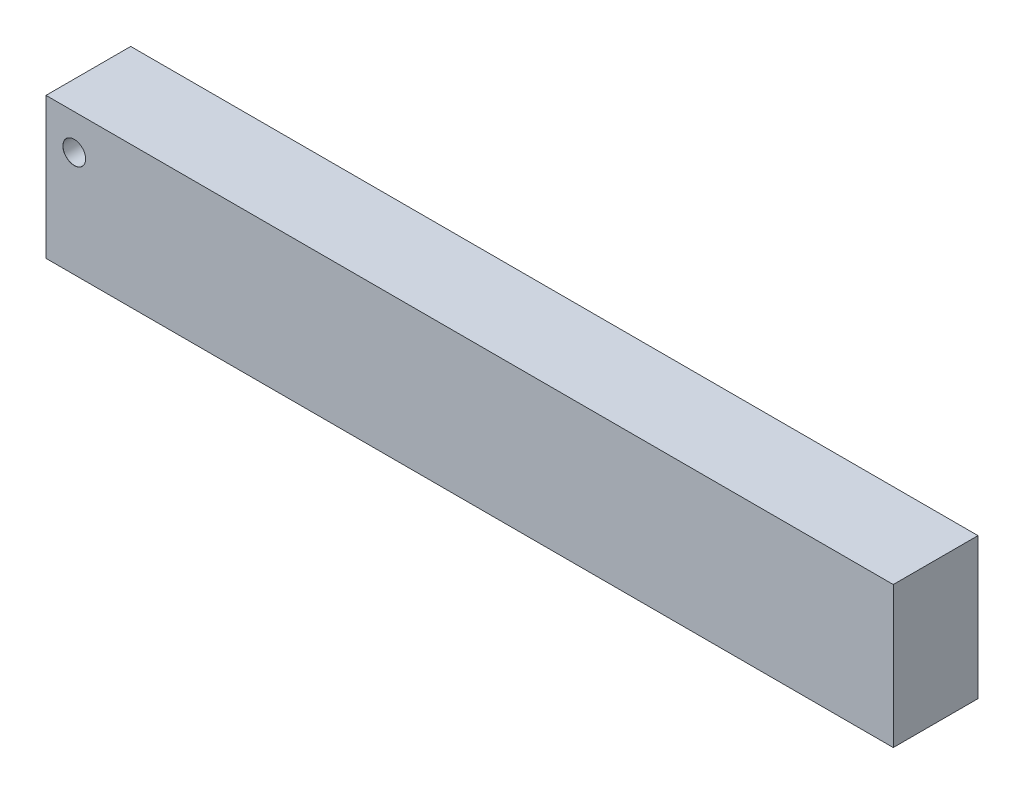
ISO-10303-21;
HEADER;
FILE_DESCRIPTION(('STEP AP214'),'2;1');
FILE_NAME('part.step','',(''),(''),'','','');
FILE_SCHEMA(('AUTOMOTIVE_DESIGN { 1 0 10303 214 1 1 1 1 }'));
ENDSEC;
DATA;
#1=APPLICATION_CONTEXT('core data for automotive mechanical design processes');
#2=APPLICATION_PROTOCOL_DEFINITION('international standard','automotive_design',2000,#1);
#3=PRODUCT_CONTEXT('',#1,'mechanical');
#4=PRODUCT('Part','Part','',(#3));
#5=PRODUCT_RELATED_PRODUCT_CATEGORY('part','',(#4));
#6=PRODUCT_DEFINITION_FORMATION('','',#4);
#7=PRODUCT_DEFINITION_CONTEXT('part definition',#1,'design');
#8=PRODUCT_DEFINITION('design','',#6,#7);
#9=PRODUCT_DEFINITION_SHAPE('','',#8);
#10=(LENGTH_UNIT() NAMED_UNIT(*) SI_UNIT(.MILLI.,.METRE.));
#11=(NAMED_UNIT(*) PLANE_ANGLE_UNIT() SI_UNIT($,.RADIAN.));
#12=(NAMED_UNIT(*) SI_UNIT($,.STERADIAN.) SOLID_ANGLE_UNIT());
#13=UNCERTAINTY_MEASURE_WITH_UNIT(LENGTH_MEASURE(1.E-05),#10,'distance_accuracy_value','');
#14=(GEOMETRIC_REPRESENTATION_CONTEXT(3) GLOBAL_UNCERTAINTY_ASSIGNED_CONTEXT((#13)) GLOBAL_UNIT_ASSIGNED_CONTEXT((#10,
#11,#12)) REPRESENTATION_CONTEXT('',''));
#15=CARTESIAN_POINT('',(0.,0.,0.));
#16=DIRECTION('',(0.,0.,1.));
#17=DIRECTION('',(1.,0.,0.));
#18=AXIS2_PLACEMENT_3D('',#15,#16,#17);
#19=CARTESIAN_POINT('',(0.,0.,30.));
#20=DIRECTION('',(1.,0.,0.));
#21=DIRECTION('',(0.,0.,-1.));
#22=AXIS2_PLACEMENT_3D('',#19,#20,#21);
#23=PLANE('',#22);
#24=DIRECTION('',(0.,-1.,0.));
#25=VECTOR('',#24,1.);
#26=CARTESIAN_POINT('',(0.,0.,0.));
#27=LINE('',#26,#25);
#28=CARTESIAN_POINT('',(0.,50.,0.));
#29=VERTEX_POINT('',#28);
#30=CARTESIAN_POINT('',(0.,0.,0.));
#31=VERTEX_POINT('',#30);
#32=EDGE_CURVE('E107',#29,#31,#27,.T.);
#33=ORIENTED_EDGE('',*,*,#32,.T.);
#34=DIRECTION('',(0.,0.,-1.));
#35=VECTOR('',#34,1.);
#36=CARTESIAN_POINT('',(0.,0.,30.));
#37=LINE('',#36,#35);
#38=CARTESIAN_POINT('',(0.,0.,30.));
#39=VERTEX_POINT('',#38);
#40=EDGE_CURVE('E11',#39,#31,#37,.T.);
#41=ORIENTED_EDGE('',*,*,#40,.F.);
#42=DIRECTION('',(0.,-1.,0.));
#43=VECTOR('',#42,1.);
#44=CARTESIAN_POINT('',(0.,0.,30.));
#45=LINE('',#44,#43);
#46=CARTESIAN_POINT('',(0.,50.,30.));
#47=VERTEX_POINT('',#46);
#48=EDGE_CURVE('E91',#47,#39,#45,.T.);
#49=ORIENTED_EDGE('',*,*,#48,.F.);
#50=DIRECTION('',(0.,0.,-1.));
#51=VECTOR('',#50,1.);
#52=CARTESIAN_POINT('',(0.,50.,30.));
#53=LINE('',#52,#51);
#54=EDGE_CURVE('E103',#47,#29,#53,.T.);
#55=ORIENTED_EDGE('',*,*,#54,.T.);
#56=EDGE_LOOP('',(#33,#41,#49,#55));
#57=FACE_BOUND('',#56,.T.);
#58=ADVANCED_FACE('F39',(#57),#23,.F.);
#59=CARTESIAN_POINT('',(0.,0.,30.));
#60=DIRECTION('',(0.,1.,0.));
#61=DIRECTION('',(0.,0.,1.));
#62=AXIS2_PLACEMENT_3D('',#59,#60,#61);
#63=PLANE('',#62);
#64=DIRECTION('',(1.,0.,0.));
#65=VECTOR('',#64,1.);
#66=CARTESIAN_POINT('',(0.,0.,0.));
#67=LINE('',#66,#65);
#68=CARTESIAN_POINT('',(300.,0.,0.));
#69=VERTEX_POINT('',#68);
#70=EDGE_CURVE('E96',#31,#69,#67,.T.);
#71=ORIENTED_EDGE('',*,*,#70,.T.);
#72=DIRECTION('',(0.,0.,-1.));
#73=VECTOR('',#72,1.);
#74=CARTESIAN_POINT('',(300.,0.,30.));
#75=LINE('',#74,#73);
#76=CARTESIAN_POINT('',(300.,0.,30.));
#77=VERTEX_POINT('',#76);
#78=EDGE_CURVE('E48',#77,#69,#75,.T.);
#79=ORIENTED_EDGE('',*,*,#78,.F.);
#80=DIRECTION('',(1.,0.,0.));
#81=VECTOR('',#80,1.);
#82=CARTESIAN_POINT('',(0.,0.,30.));
#83=LINE('',#82,#81);
#84=EDGE_CURVE('E86',#39,#77,#83,.T.);
#85=ORIENTED_EDGE('',*,*,#84,.F.);
#86=ORIENTED_EDGE('',*,*,#40,.T.);
#87=EDGE_LOOP('',(#71,#79,#85,#86));
#88=FACE_BOUND('',#87,.T.);
#89=ADVANCED_FACE('F95',(#88),#63,.F.);
#90=CARTESIAN_POINT('',(300.,0.,30.));
#91=DIRECTION('',(-1.,0.,0.));
#92=DIRECTION('',(0.,0.,1.));
#93=AXIS2_PLACEMENT_3D('',#90,#91,#92);
#94=PLANE('',#93);
#95=DIRECTION('',(0.,1.,0.));
#96=VECTOR('',#95,1.);
#97=CARTESIAN_POINT('',(300.,0.,0.));
#98=LINE('',#97,#96);
#99=CARTESIAN_POINT('',(300.,50.,0.));
#100=VERTEX_POINT('',#99);
#101=EDGE_CURVE('E73',#69,#100,#98,.T.);
#102=ORIENTED_EDGE('',*,*,#101,.T.);
#103=DIRECTION('',(0.,0.,-1.));
#104=VECTOR('',#103,1.);
#105=CARTESIAN_POINT('',(300.,50.,30.));
#106=LINE('',#105,#104);
#107=CARTESIAN_POINT('',(300.,50.,30.));
#108=VERTEX_POINT('',#107);
#109=EDGE_CURVE('E98',#108,#100,#106,.T.);
#110=ORIENTED_EDGE('',*,*,#109,.F.);
#111=DIRECTION('',(0.,1.,0.));
#112=VECTOR('',#111,1.);
#113=CARTESIAN_POINT('',(300.,0.,30.));
#114=LINE('',#113,#112);
#115=EDGE_CURVE('E89',#77,#108,#114,.T.);
#116=ORIENTED_EDGE('',*,*,#115,.F.);
#117=ORIENTED_EDGE('',*,*,#78,.T.);
#118=EDGE_LOOP('',(#102,#110,#116,#117));
#119=FACE_BOUND('',#118,.T.);
#120=ADVANCED_FACE('F99',(#119),#94,.F.);
#121=CARTESIAN_POINT('',(0.,50.,30.));
#122=DIRECTION('',(0.,-1.,0.));
#123=DIRECTION('',(0.,0.,-1.));
#124=AXIS2_PLACEMENT_3D('',#121,#122,#123);
#125=PLANE('',#124);
#126=DIRECTION('',(-1.,0.,0.));
#127=VECTOR('',#126,1.);
#128=CARTESIAN_POINT('',(0.,50.,0.));
#129=LINE('',#128,#127);
#130=EDGE_CURVE('E79',#100,#29,#129,.T.);
#131=ORIENTED_EDGE('',*,*,#130,.T.);
#132=ORIENTED_EDGE('',*,*,#54,.F.);
#133=DIRECTION('',(-1.,0.,0.));
#134=VECTOR('',#133,1.);
#135=CARTESIAN_POINT('',(0.,50.,30.));
#136=LINE('',#135,#134);
#137=EDGE_CURVE('E56',#108,#47,#136,.T.);
#138=ORIENTED_EDGE('',*,*,#137,.F.);
#139=ORIENTED_EDGE('',*,*,#109,.T.);
#140=EDGE_LOOP('',(#131,#132,#138,#139));
#141=FACE_BOUND('',#140,.T.);
#142=ADVANCED_FACE('F121',(#141),#125,.F.);
#143=CARTESIAN_POINT('',(0.,0.,30.));
#144=DIRECTION('',(0.,0.,-1.));
#145=DIRECTION('',(-1.,0.,0.));
#146=AXIS2_PLACEMENT_3D('',#143,#144,#145);
#147=PLANE('',#146);
#148=CARTESIAN_POINT('',(10.,37.5,30.));
#149=DIRECTION('',(0.,0.,1.));
#150=DIRECTION('',(1.,0.,0.));
#151=AXIS2_PLACEMENT_3D('',#148,#149,#150);
#152=CIRCLE('',#151,4.025);
#153=CARTESIAN_POINT('',(14.025,37.5,30.));
#154=VERTEX_POINT('',#153);
#155=EDGE_CURVE('E135',#154,#154,#152,.T.);
#156=ORIENTED_EDGE('',*,*,#155,.F.);
#157=EDGE_LOOP('',(#156));
#158=FACE_BOUND('',#157,.T.);
#159=ORIENTED_EDGE('',*,*,#48,.T.);
#160=ORIENTED_EDGE('',*,*,#84,.T.);
#161=ORIENTED_EDGE('',*,*,#115,.T.);
#162=ORIENTED_EDGE('',*,*,#137,.T.);
#163=EDGE_LOOP('',(#159,#160,#161,#162));
#164=FACE_BOUND('',#163,.T.);
#165=ADVANCED_FACE('F87',(#158,#164),#147,.F.);
#166=CARTESIAN_POINT('',(0.,0.,0.));
#167=DIRECTION('',(0.,0.,-1.));
#168=DIRECTION('',(-1.,0.,0.));
#169=AXIS2_PLACEMENT_3D('',#166,#167,#168);
#170=PLANE('',#169);
#171=CARTESIAN_POINT('',(10.,37.5,0.));
#172=DIRECTION('',(0.,0.,1.));
#173=DIRECTION('',(1.,0.,0.));
#174=AXIS2_PLACEMENT_3D('',#171,#172,#173);
#175=CIRCLE('',#174,3.99999999999999);
#176=CARTESIAN_POINT('',(14.,37.5,0.));
#177=VERTEX_POINT('',#176);
#178=EDGE_CURVE('E111',#177,#177,#175,.T.);
#179=ORIENTED_EDGE('',*,*,#178,.T.);
#180=EDGE_LOOP('',(#179));
#181=FACE_BOUND('',#180,.T.);
#182=ORIENTED_EDGE('',*,*,#32,.F.);
#183=ORIENTED_EDGE('',*,*,#130,.F.);
#184=ORIENTED_EDGE('',*,*,#101,.F.);
#185=ORIENTED_EDGE('',*,*,#70,.F.);
#186=EDGE_LOOP('',(#182,#183,#184,#185));
#187=FACE_BOUND('',#186,.T.);
#188=ADVANCED_FACE('F124',(#181,#187),#170,.T.);
#189=CARTESIAN_POINT('',(10.,37.5,30.));
#190=DIRECTION('',(0.,0.,1.));
#191=DIRECTION('',(1.,0.,0.));
#192=AXIS2_PLACEMENT_3D('',#189,#190,#191);
#193=CYLINDRICAL_SURFACE('',#192,4.);
#194=ORIENTED_EDGE('',*,*,#178,.F.);
#195=EDGE_LOOP('',(#194));
#196=FACE_BOUND('',#195,.T.);
#197=CARTESIAN_POINT('',(10.,37.5,29.975));
#198=DIRECTION('',(0.,0.,1.));
#199=DIRECTION('',(1.,0.,0.));
#200=AXIS2_PLACEMENT_3D('',#197,#198,#199);
#201=CIRCLE('',#200,4.);
#202=CARTESIAN_POINT('',(14.,37.5,29.975));
#203=VERTEX_POINT('',#202);
#204=EDGE_CURVE('E131',#203,#203,#201,.T.);
#205=ORIENTED_EDGE('',*,*,#204,.T.);
#206=EDGE_LOOP('',(#205));
#207=FACE_BOUND('',#206,.T.);
#208=ADVANCED_FACE('F148',(#196,#207),#193,.F.);
#209=CARTESIAN_POINT('',(10.,37.5,30.));
#210=DIRECTION('',(0.,0.,1.));
#211=DIRECTION('',(1.,0.,0.));
#212=AXIS2_PLACEMENT_3D('',#209,#210,#211);
#213=CONICAL_SURFACE('',#212,4.025,0.785398163397518);
#214=ORIENTED_EDGE('',*,*,#204,.F.);
#215=EDGE_LOOP('',(#214));
#216=FACE_BOUND('',#215,.T.);
#217=ORIENTED_EDGE('',*,*,#155,.T.);
#218=EDGE_LOOP('',(#217));
#219=FACE_BOUND('',#218,.T.);
#220=ADVANCED_FACE('F140',(#216,#219),#213,.F.);
#221=CLOSED_SHELL('',(#58,#89,#120,#142,#165,#188,#208,#220));
#222=MANIFOLD_SOLID_BREP('B2',#221);
#223=ADVANCED_BREP_SHAPE_REPRESENTATION('',(#18,#222),#14);
#224=SHAPE_DEFINITION_REPRESENTATION(#9,#223);
ENDSEC;
END-ISO-10303-21;
